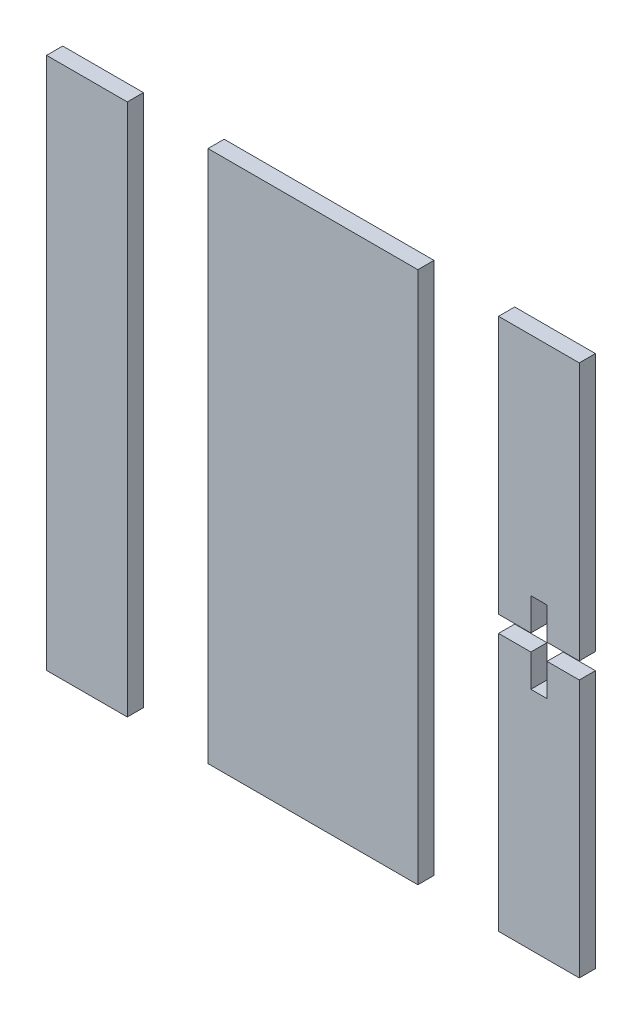
ISO-10303-21;
HEADER;
FILE_DESCRIPTION(('STEP AP214'),'2;1');
FILE_NAME('part.step','',(''),(''),'','','');
FILE_SCHEMA(('AUTOMOTIVE_DESIGN { 1 0 10303 214 1 1 1 1 }'));
ENDSEC;
DATA;
#1=APPLICATION_CONTEXT('core data for automotive mechanical design processes');
#2=APPLICATION_PROTOCOL_DEFINITION('international standard','automotive_design',2000,#1);
#3=PRODUCT_CONTEXT('',#1,'mechanical');
#4=PRODUCT('Part','Part','',(#3));
#5=PRODUCT_RELATED_PRODUCT_CATEGORY('part','',(#4));
#6=PRODUCT_DEFINITION_FORMATION('','',#4);
#7=PRODUCT_DEFINITION_CONTEXT('part definition',#1,'design');
#8=PRODUCT_DEFINITION('design','',#6,#7);
#9=PRODUCT_DEFINITION_SHAPE('','',#8);
#10=(LENGTH_UNIT() NAMED_UNIT(*) SI_UNIT(.MILLI.,.METRE.));
#11=(NAMED_UNIT(*) PLANE_ANGLE_UNIT() SI_UNIT($,.RADIAN.));
#12=(NAMED_UNIT(*) SI_UNIT($,.STERADIAN.) SOLID_ANGLE_UNIT());
#13=UNCERTAINTY_MEASURE_WITH_UNIT(LENGTH_MEASURE(1.E-05),#10,'distance_accuracy_value','');
#14=(GEOMETRIC_REPRESENTATION_CONTEXT(3) GLOBAL_UNCERTAINTY_ASSIGNED_CONTEXT((#13)) GLOBAL_UNIT_ASSIGNED_CONTEXT((#10,
#11,#12)) REPRESENTATION_CONTEXT('',''));
#15=CARTESIAN_POINT('',(0.,0.,0.));
#16=DIRECTION('',(0.,0.,1.));
#17=DIRECTION('',(1.,0.,0.));
#18=AXIS2_PLACEMENT_3D('',#15,#16,#17);
#19=CARTESIAN_POINT('',(3.53495725651415,0.,0.1));
#20=DIRECTION('',(1.,0.,0.));
#21=DIRECTION('',(0.,0.,-1.));
#22=AXIS2_PLACEMENT_3D('',#19,#20,#21);
#23=PLANE('',#22);
#24=DIRECTION('',(0.,0.,1.));
#25=VECTOR('',#24,1.);
#26=CARTESIAN_POINT('',(3.53495725651415,1.58020971020154,0.));
#27=LINE('',#26,#25);
#28=CARTESIAN_POINT('',(3.53495725651415,1.58020971020154,0.));
#29=VERTEX_POINT('',#28);
#30=CARTESIAN_POINT('',(3.53495725651415,1.58020971020154,0.1));
#31=VERTEX_POINT('',#30);
#32=EDGE_CURVE('E12',#29,#31,#27,.T.);
#33=ORIENTED_EDGE('',*,*,#32,.F.);
#34=DIRECTION('',(0.,-1.,0.));
#35=VECTOR('',#34,1.);
#36=CARTESIAN_POINT('',(3.53495725651415,0.,0.));
#37=LINE('',#36,#35);
#38=CARTESIAN_POINT('',(3.53495725651415,3.1790821036664,0.));
#39=VERTEX_POINT('',#38);
#40=EDGE_CURVE('E49',#39,#29,#37,.T.);
#41=ORIENTED_EDGE('',*,*,#40,.F.);
#42=DIRECTION('',(0.,0.,-1.));
#43=VECTOR('',#42,1.);
#44=CARTESIAN_POINT('',(3.53495725651415,3.1790821036664,0.1));
#45=LINE('',#44,#43);
#46=CARTESIAN_POINT('',(3.53495725651415,3.1790821036664,0.1));
#47=VERTEX_POINT('',#46);
#48=EDGE_CURVE('E136',#47,#39,#45,.T.);
#49=ORIENTED_EDGE('',*,*,#48,.F.);
#50=DIRECTION('',(0.,-1.,0.));
#51=VECTOR('',#50,1.);
#52=CARTESIAN_POINT('',(3.53495725651415,0.,0.1));
#53=LINE('',#52,#51);
#54=EDGE_CURVE('E134',#47,#31,#53,.T.);
#55=ORIENTED_EDGE('',*,*,#54,.T.);
#56=EDGE_LOOP('',(#33,#41,#49,#55));
#57=FACE_BOUND('',#56,.T.);
#58=ADVANCED_FACE('F46',(#57),#23,.T.);
#59=CARTESIAN_POINT('',(3.03495725651415,0.,0.1));
#60=DIRECTION('',(1.,0.,0.));
#61=DIRECTION('',(0.,1.,0.));
#62=AXIS2_PLACEMENT_3D('',#59,#60,#61);
#63=PLANE('',#62);
#64=DIRECTION('',(0.,-1.,0.));
#65=VECTOR('',#64,1.);
#66=CARTESIAN_POINT('',(3.03495725651415,0.,0.));
#67=LINE('',#66,#65);
#68=CARTESIAN_POINT('',(3.03495725651415,3.1790821036664,0.));
#69=VERTEX_POINT('',#68);
#70=CARTESIAN_POINT('',(3.03495725651415,1.58020971020154,0.));
#71=VERTEX_POINT('',#70);
#72=EDGE_CURVE('E116',#69,#71,#67,.T.);
#73=ORIENTED_EDGE('',*,*,#72,.T.);
#74=DIRECTION('',(0.,0.,1.));
#75=VECTOR('',#74,1.);
#76=CARTESIAN_POINT('',(3.03495725651415,1.58020971020154,0.));
#77=LINE('',#76,#75);
#78=CARTESIAN_POINT('',(3.03495725651415,1.58020971020154,0.1));
#79=VERTEX_POINT('',#78);
#80=EDGE_CURVE('E123',#71,#79,#77,.T.);
#81=ORIENTED_EDGE('',*,*,#80,.T.);
#82=DIRECTION('',(0.,-1.,0.));
#83=VECTOR('',#82,1.);
#84=CARTESIAN_POINT('',(3.03495725651415,0.,0.1));
#85=LINE('',#84,#83);
#86=CARTESIAN_POINT('',(3.03495725651415,3.1790821036664,0.1));
#87=VERTEX_POINT('',#86);
#88=EDGE_CURVE('E118',#87,#79,#85,.T.);
#89=ORIENTED_EDGE('',*,*,#88,.F.);
#90=DIRECTION('',(0.,0.,-1.));
#91=VECTOR('',#90,1.);
#92=CARTESIAN_POINT('',(3.03495725651415,3.1790821036664,0.1));
#93=LINE('',#92,#91);
#94=EDGE_CURVE('E112',#87,#69,#93,.T.);
#95=ORIENTED_EDGE('',*,*,#94,.T.);
#96=EDGE_LOOP('',(#73,#81,#89,#95));
#97=FACE_BOUND('',#96,.T.);
#98=ADVANCED_FACE('F114',(#97),#63,.F.);
#99=CARTESIAN_POINT('',(0.,0.,0.1));
#100=DIRECTION('',(0.,0.,1.));
#101=DIRECTION('',(1.,0.,0.));
#102=AXIS2_PLACEMENT_3D('',#99,#100,#101);
#103=PLANE('',#102);
#104=DIRECTION('',(-1.,0.,0.));
#105=VECTOR('',#104,1.);
#106=CARTESIAN_POINT('',(3.03495725651415,1.58020971020154,0.1));
#107=LINE('',#106,#105);
#108=CARTESIAN_POINT('',(3.23495725651415,1.58020971020154,0.1));
#109=VERTEX_POINT('',#108);
#110=EDGE_CURVE('E158',#109,#79,#107,.T.);
#111=ORIENTED_EDGE('',*,*,#110,.F.);
#112=DIRECTION('',(0.,-1.,0.));
#113=VECTOR('',#112,1.);
#114=CARTESIAN_POINT('',(3.23495725651415,1.78020971020154,0.1));
#115=LINE('',#114,#113);
#116=CARTESIAN_POINT('',(3.23495725651415,1.78020971020154,0.1));
#117=VERTEX_POINT('',#116);
#118=EDGE_CURVE('E155',#117,#109,#115,.T.);
#119=ORIENTED_EDGE('',*,*,#118,.F.);
#120=DIRECTION('',(-1.,0.,0.));
#121=VECTOR('',#120,1.);
#122=CARTESIAN_POINT('',(3.23495725651415,1.78020971020154,0.1));
#123=LINE('',#122,#121);
#124=CARTESIAN_POINT('',(3.33495725651415,1.78020971020154,0.1));
#125=VERTEX_POINT('',#124);
#126=EDGE_CURVE('E152',#125,#117,#123,.T.);
#127=ORIENTED_EDGE('',*,*,#126,.F.);
#128=DIRECTION('',(0.,1.,0.));
#129=VECTOR('',#128,1.);
#130=CARTESIAN_POINT('',(3.33495725651415,1.78020971020154,0.1));
#131=LINE('',#130,#129);
#132=CARTESIAN_POINT('',(3.33495725651415,1.58020971020154,0.1));
#133=VERTEX_POINT('',#132);
#134=EDGE_CURVE('E150',#133,#125,#131,.T.);
#135=ORIENTED_EDGE('',*,*,#134,.F.);
#136=DIRECTION('',(-1.,0.,0.));
#137=VECTOR('',#136,1.);
#138=CARTESIAN_POINT('',(3.33495725651415,1.58020971020154,0.1));
#139=LINE('',#138,#137);
#140=EDGE_CURVE('E55',#31,#133,#139,.T.);
#141=ORIENTED_EDGE('',*,*,#140,.F.);
#142=ORIENTED_EDGE('',*,*,#54,.F.);
#143=DIRECTION('',(1.,0.,0.));
#144=VECTOR('',#143,1.);
#145=CARTESIAN_POINT('',(0.,3.1790821036664,0.1));
#146=LINE('',#145,#144);
#147=EDGE_CURVE('E144',#87,#47,#146,.T.);
#148=ORIENTED_EDGE('',*,*,#147,.F.);
#149=ORIENTED_EDGE('',*,*,#88,.T.);
#150=EDGE_LOOP('',(#111,#119,#127,#135,#141,#142,#148,#149));
#151=FACE_BOUND('',#150,.T.);
#152=ADVANCED_FACE('F180',(#151),#103,.T.);
#153=CARTESIAN_POINT('',(0.,0.,0.));
#154=DIRECTION('',(0.,0.,1.));
#155=DIRECTION('',(1.,0.,0.));
#156=AXIS2_PLACEMENT_3D('',#153,#154,#155);
#157=PLANE('',#156);
#158=DIRECTION('',(0.,-1.,0.));
#159=VECTOR('',#158,1.);
#160=CARTESIAN_POINT('',(3.23495725651415,1.78020971020154,0.));
#161=LINE('',#160,#159);
#162=CARTESIAN_POINT('',(3.23495725651415,1.78020971020154,0.));
#163=VERTEX_POINT('',#162);
#164=CARTESIAN_POINT('',(3.23495725651415,1.58020971020154,0.));
#165=VERTEX_POINT('',#164);
#166=EDGE_CURVE('E140',#163,#165,#161,.T.);
#167=ORIENTED_EDGE('',*,*,#166,.T.);
#168=DIRECTION('',(-1.,0.,0.));
#169=VECTOR('',#168,1.);
#170=CARTESIAN_POINT('',(3.03495725651415,1.58020971020154,0.));
#171=LINE('',#170,#169);
#172=EDGE_CURVE('E133',#165,#71,#171,.T.);
#173=ORIENTED_EDGE('',*,*,#172,.T.);
#174=ORIENTED_EDGE('',*,*,#72,.F.);
#175=DIRECTION('',(1.,0.,0.));
#176=VECTOR('',#175,1.);
#177=CARTESIAN_POINT('',(0.,3.1790821036664,0.));
#178=LINE('',#177,#176);
#179=EDGE_CURVE('E131',#69,#39,#178,.T.);
#180=ORIENTED_EDGE('',*,*,#179,.T.);
#181=ORIENTED_EDGE('',*,*,#40,.T.);
#182=DIRECTION('',(-1.,0.,0.));
#183=VECTOR('',#182,1.);
#184=CARTESIAN_POINT('',(3.33495725651415,1.58020971020154,0.));
#185=LINE('',#184,#183);
#186=CARTESIAN_POINT('',(3.33495725651415,1.58020971020154,0.));
#187=VERTEX_POINT('',#186);
#188=EDGE_CURVE('E139',#29,#187,#185,.T.);
#189=ORIENTED_EDGE('',*,*,#188,.T.);
#190=DIRECTION('',(0.,1.,0.));
#191=VECTOR('',#190,1.);
#192=CARTESIAN_POINT('',(3.33495725651415,1.78020971020154,0.));
#193=LINE('',#192,#191);
#194=CARTESIAN_POINT('',(3.33495725651415,1.78020971020154,0.));
#195=VERTEX_POINT('',#194);
#196=EDGE_CURVE('E169',#187,#195,#193,.T.);
#197=ORIENTED_EDGE('',*,*,#196,.T.);
#198=DIRECTION('',(-1.,0.,0.));
#199=VECTOR('',#198,1.);
#200=CARTESIAN_POINT('',(3.23495725651415,1.78020971020154,0.));
#201=LINE('',#200,#199);
#202=EDGE_CURVE('E145',#195,#163,#201,.T.);
#203=ORIENTED_EDGE('',*,*,#202,.T.);
#204=EDGE_LOOP('',(#167,#173,#174,#180,#181,#189,#197,#203));
#205=FACE_BOUND('',#204,.T.);
#206=ADVANCED_FACE('F129',(#205),#157,.F.);
#207=CARTESIAN_POINT('',(0.,3.1790821036664,0.1));
#208=DIRECTION('',(0.,1.,0.));
#209=DIRECTION('',(0.,0.,1.));
#210=AXIS2_PLACEMENT_3D('',#207,#208,#209);
#211=PLANE('',#210);
#212=ORIENTED_EDGE('',*,*,#179,.F.);
#213=ORIENTED_EDGE('',*,*,#94,.F.);
#214=ORIENTED_EDGE('',*,*,#147,.T.);
#215=ORIENTED_EDGE('',*,*,#48,.T.);
#216=EDGE_LOOP('',(#212,#213,#214,#215));
#217=FACE_BOUND('',#216,.T.);
#218=ADVANCED_FACE('F135',(#217),#211,.T.);
#219=CARTESIAN_POINT('',(3.03495725651415,1.58020971020154,0.));
#220=DIRECTION('',(0.,1.,0.));
#221=DIRECTION('',(0.,0.,1.));
#222=AXIS2_PLACEMENT_3D('',#219,#220,#221);
#223=PLANE('',#222);
#224=ORIENTED_EDGE('',*,*,#110,.T.);
#225=ORIENTED_EDGE('',*,*,#80,.F.);
#226=ORIENTED_EDGE('',*,*,#172,.F.);
#227=DIRECTION('',(0.,0.,1.));
#228=VECTOR('',#227,1.);
#229=CARTESIAN_POINT('',(3.23495725651415,1.58020971020154,0.));
#230=LINE('',#229,#228);
#231=EDGE_CURVE('E156',#165,#109,#230,.T.);
#232=ORIENTED_EDGE('',*,*,#231,.T.);
#233=EDGE_LOOP('',(#224,#225,#226,#232));
#234=FACE_BOUND('',#233,.T.);
#235=ADVANCED_FACE('F192',(#234),#223,.F.);
#236=CARTESIAN_POINT('',(3.23495725651415,1.78020971020154,0.));
#237=DIRECTION('',(-1.,0.,0.));
#238=DIRECTION('',(0.,0.,1.));
#239=AXIS2_PLACEMENT_3D('',#236,#237,#238);
#240=PLANE('',#239);
#241=ORIENTED_EDGE('',*,*,#118,.T.);
#242=ORIENTED_EDGE('',*,*,#231,.F.);
#243=ORIENTED_EDGE('',*,*,#166,.F.);
#244=DIRECTION('',(0.,0.,1.));
#245=VECTOR('',#244,1.);
#246=CARTESIAN_POINT('',(3.23495725651415,1.78020971020154,0.));
#247=LINE('',#246,#245);
#248=EDGE_CURVE('E153',#163,#117,#247,.T.);
#249=ORIENTED_EDGE('',*,*,#248,.T.);
#250=EDGE_LOOP('',(#241,#242,#243,#249));
#251=FACE_BOUND('',#250,.T.);
#252=ADVANCED_FACE('F190',(#251),#240,.F.);
#253=CARTESIAN_POINT('',(3.23495725651415,1.78020971020154,0.));
#254=DIRECTION('',(0.,1.,0.));
#255=DIRECTION('',(0.,0.,1.));
#256=AXIS2_PLACEMENT_3D('',#253,#254,#255);
#257=PLANE('',#256);
#258=ORIENTED_EDGE('',*,*,#126,.T.);
#259=ORIENTED_EDGE('',*,*,#248,.F.);
#260=ORIENTED_EDGE('',*,*,#202,.F.);
#261=DIRECTION('',(0.,0.,1.));
#262=VECTOR('',#261,1.);
#263=CARTESIAN_POINT('',(3.33495725651415,1.78020971020154,0.));
#264=LINE('',#263,#262);
#265=EDGE_CURVE('E86',#195,#125,#264,.T.);
#266=ORIENTED_EDGE('',*,*,#265,.T.);
#267=EDGE_LOOP('',(#258,#259,#260,#266));
#268=FACE_BOUND('',#267,.T.);
#269=ADVANCED_FACE('F187',(#268),#257,.F.);
#270=CARTESIAN_POINT('',(3.33495725651415,1.78020971020154,0.));
#271=DIRECTION('',(1.,0.,0.));
#272=DIRECTION('',(0.,1.,0.));
#273=AXIS2_PLACEMENT_3D('',#270,#271,#272);
#274=PLANE('',#273);
#275=ORIENTED_EDGE('',*,*,#134,.T.);
#276=ORIENTED_EDGE('',*,*,#265,.F.);
#277=ORIENTED_EDGE('',*,*,#196,.F.);
#278=DIRECTION('',(0.,0.,1.));
#279=VECTOR('',#278,1.);
#280=CARTESIAN_POINT('',(3.33495725651415,1.58020971020154,0.));
#281=LINE('',#280,#279);
#282=EDGE_CURVE('E147',#187,#133,#281,.T.);
#283=ORIENTED_EDGE('',*,*,#282,.T.);
#284=EDGE_LOOP('',(#275,#276,#277,#283));
#285=FACE_BOUND('',#284,.T.);
#286=ADVANCED_FACE('F185',(#285),#274,.F.);
#287=CARTESIAN_POINT('',(3.33495725651415,1.58020971020154,0.));
#288=DIRECTION('',(0.,1.,0.));
#289=DIRECTION('',(0.,0.,1.));
#290=AXIS2_PLACEMENT_3D('',#287,#288,#289);
#291=PLANE('',#290);
#292=ORIENTED_EDGE('',*,*,#140,.T.);
#293=ORIENTED_EDGE('',*,*,#282,.F.);
#294=ORIENTED_EDGE('',*,*,#188,.F.);
#295=ORIENTED_EDGE('',*,*,#32,.T.);
#296=EDGE_LOOP('',(#292,#293,#294,#295));
#297=FACE_BOUND('',#296,.T.);
#298=ADVANCED_FACE('F184',(#297),#291,.F.);
#299=CLOSED_SHELL('',(#58,#98,#152,#206,#218,#235,#252,#269,#286,#298));
#300=MANIFOLD_SOLID_BREP('B2',#299);
#301=CARTESIAN_POINT('',(0.,-0.120917896333602,0.1));
#302=DIRECTION('',(0.,1.,0.));
#303=DIRECTION('',(0.,0.,1.));
#304=AXIS2_PLACEMENT_3D('',#301,#302,#303);
#305=PLANE('',#304);
#306=DIRECTION('',(1.,0.,0.));
#307=VECTOR('',#306,1.);
#308=CARTESIAN_POINT('',(0.,-0.120917896333602,0.));
#309=LINE('',#308,#307);
#310=CARTESIAN_POINT('',(3.03495725651415,-0.120917896333602,0.));
#311=VERTEX_POINT('',#310);
#312=CARTESIAN_POINT('',(3.53495725651415,-0.120917896333602,0.));
#313=VERTEX_POINT('',#312);
#314=EDGE_CURVE('E328',#311,#313,#309,.T.);
#315=ORIENTED_EDGE('',*,*,#314,.T.);
#316=DIRECTION('',(0.,0.,-1.));
#317=VECTOR('',#316,1.);
#318=CARTESIAN_POINT('',(3.53495725651415,-0.120917896333602,0.1));
#319=LINE('',#318,#317);
#320=CARTESIAN_POINT('',(3.53495725651415,-0.120917896333602,0.1));
#321=VERTEX_POINT('',#320);
#322=EDGE_CURVE('E292',#321,#313,#319,.T.);
#323=ORIENTED_EDGE('',*,*,#322,.F.);
#324=DIRECTION('',(1.,0.,0.));
#325=VECTOR('',#324,1.);
#326=CARTESIAN_POINT('',(0.,-0.120917896333602,0.1));
#327=LINE('',#326,#325);
#328=CARTESIAN_POINT('',(3.03495725651415,-0.120917896333602,0.1));
#329=VERTEX_POINT('',#328);
#330=EDGE_CURVE('E337',#329,#321,#327,.T.);
#331=ORIENTED_EDGE('',*,*,#330,.F.);
#332=DIRECTION('',(0.,0.,-1.));
#333=VECTOR('',#332,1.);
#334=CARTESIAN_POINT('',(3.03495725651415,-0.120917896333602,0.1));
#335=LINE('',#334,#333);
#336=EDGE_CURVE('E44',#329,#311,#335,.T.);
#337=ORIENTED_EDGE('',*,*,#336,.T.);
#338=EDGE_LOOP('',(#315,#323,#331,#337));
#339=FACE_BOUND('',#338,.T.);
#340=ADVANCED_FACE('F284',(#339),#305,.F.);
#341=CARTESIAN_POINT('',(0.,0.,0.));
#342=DIRECTION('',(0.,0.,1.));
#343=DIRECTION('',(1.,0.,0.));
#344=AXIS2_PLACEMENT_3D('',#341,#342,#343);
#345=PLANE('',#344);
#346=DIRECTION('',(0.,1.,0.));
#347=VECTOR('',#346,1.);
#348=CARTESIAN_POINT('',(3.33495725651415,1.47795449713126,0.));
#349=LINE('',#348,#347);
#350=CARTESIAN_POINT('',(3.33495725651415,1.27795449713126,0.));
#351=VERTEX_POINT('',#350);
#352=CARTESIAN_POINT('',(3.33495725651415,1.47795449713126,0.));
#353=VERTEX_POINT('',#352);
#354=EDGE_CURVE('E378',#351,#353,#349,.T.);
#355=ORIENTED_EDGE('',*,*,#354,.T.);
#356=DIRECTION('',(1.,0.,0.));
#357=VECTOR('',#356,1.);
#358=CARTESIAN_POINT('',(3.33495725651415,1.47795449713126,0.));
#359=LINE('',#358,#357);
#360=CARTESIAN_POINT('',(3.53495725651415,1.47795449713126,0.));
#361=VERTEX_POINT('',#360);
#362=EDGE_CURVE('E330',#353,#361,#359,.T.);
#363=ORIENTED_EDGE('',*,*,#362,.T.);
#364=DIRECTION('',(0.,-1.,0.));
#365=VECTOR('',#364,1.);
#366=CARTESIAN_POINT('',(3.53495725651415,0.,0.));
#367=LINE('',#366,#365);
#368=EDGE_CURVE('E323',#361,#313,#367,.T.);
#369=ORIENTED_EDGE('',*,*,#368,.T.);
#370=ORIENTED_EDGE('',*,*,#314,.F.);
#371=DIRECTION('',(0.,-1.,0.));
#372=VECTOR('',#371,1.);
#373=CARTESIAN_POINT('',(3.03495725651415,0.,0.));
#374=LINE('',#373,#372);
#375=CARTESIAN_POINT('',(3.03495725651415,1.47795449713126,0.));
#376=VERTEX_POINT('',#375);
#377=EDGE_CURVE('E331',#376,#311,#374,.T.);
#378=ORIENTED_EDGE('',*,*,#377,.F.);
#379=DIRECTION('',(1.,0.,0.));
#380=VECTOR('',#379,1.);
#381=CARTESIAN_POINT('',(3.03495725651415,1.47795449713126,0.));
#382=LINE('',#381,#380);
#383=CARTESIAN_POINT('',(3.23495725651415,1.47795449713126,0.));
#384=VERTEX_POINT('',#383);
#385=EDGE_CURVE('E364',#376,#384,#382,.T.);
#386=ORIENTED_EDGE('',*,*,#385,.T.);
#387=DIRECTION('',(0.,-1.,0.));
#388=VECTOR('',#387,1.);
#389=CARTESIAN_POINT('',(3.23495725651415,1.47795449713126,0.));
#390=LINE('',#389,#388);
#391=CARTESIAN_POINT('',(3.23495725651415,1.27795449713126,0.));
#392=VERTEX_POINT('',#391);
#393=EDGE_CURVE('E299',#384,#392,#390,.T.);
#394=ORIENTED_EDGE('',*,*,#393,.T.);
#395=DIRECTION('',(1.,0.,0.));
#396=VECTOR('',#395,1.);
#397=CARTESIAN_POINT('',(3.23495725651415,1.27795449713126,0.));
#398=LINE('',#397,#396);
#399=EDGE_CURVE('E380',#392,#351,#398,.T.);
#400=ORIENTED_EDGE('',*,*,#399,.T.);
#401=EDGE_LOOP('',(#355,#363,#369,#370,#378,#386,#394,#400));
#402=FACE_BOUND('',#401,.T.);
#403=ADVANCED_FACE('F325',(#402),#345,.F.);
#404=CARTESIAN_POINT('',(0.,0.,0.1));
#405=DIRECTION('',(0.,0.,1.));
#406=DIRECTION('',(1.,0.,0.));
#407=AXIS2_PLACEMENT_3D('',#404,#405,#406);
#408=PLANE('',#407);
#409=DIRECTION('',(1.,0.,0.));
#410=VECTOR('',#409,1.);
#411=CARTESIAN_POINT('',(3.33495725651415,1.47795449713126,0.1));
#412=LINE('',#411,#410);
#413=CARTESIAN_POINT('',(3.33495725651415,1.47795449713126,0.1));
#414=VERTEX_POINT('',#413);
#415=CARTESIAN_POINT('',(3.53495725651415,1.47795449713126,0.1));
#416=VERTEX_POINT('',#415);
#417=EDGE_CURVE('E361',#414,#416,#412,.T.);
#418=ORIENTED_EDGE('',*,*,#417,.F.);
#419=DIRECTION('',(0.,1.,0.));
#420=VECTOR('',#419,1.);
#421=CARTESIAN_POINT('',(3.33495725651415,1.47795449713126,0.1));
#422=LINE('',#421,#420);
#423=CARTESIAN_POINT('',(3.33495725651415,1.27795449713126,0.1));
#424=VERTEX_POINT('',#423);
#425=EDGE_CURVE('E365',#424,#414,#422,.T.);
#426=ORIENTED_EDGE('',*,*,#425,.F.);
#427=DIRECTION('',(1.,0.,0.));
#428=VECTOR('',#427,1.);
#429=CARTESIAN_POINT('',(3.23495725651415,1.27795449713126,0.1));
#430=LINE('',#429,#428);
#431=CARTESIAN_POINT('',(3.23495725651415,1.27795449713126,0.1));
#432=VERTEX_POINT('',#431);
#433=EDGE_CURVE('E368',#432,#424,#430,.T.);
#434=ORIENTED_EDGE('',*,*,#433,.F.);
#435=DIRECTION('',(0.,-1.,0.));
#436=VECTOR('',#435,1.);
#437=CARTESIAN_POINT('',(3.23495725651415,1.47795449713126,0.1));
#438=LINE('',#437,#436);
#439=CARTESIAN_POINT('',(3.23495725651415,1.47795449713126,0.1));
#440=VERTEX_POINT('',#439);
#441=EDGE_CURVE('E371',#440,#432,#438,.T.);
#442=ORIENTED_EDGE('',*,*,#441,.F.);
#443=DIRECTION('',(1.,0.,0.));
#444=VECTOR('',#443,1.);
#445=CARTESIAN_POINT('',(3.03495725651415,1.47795449713126,0.1));
#446=LINE('',#445,#444);
#447=CARTESIAN_POINT('',(3.03495725651415,1.47795449713126,0.1));
#448=VERTEX_POINT('',#447);
#449=EDGE_CURVE('E374',#448,#440,#446,.T.);
#450=ORIENTED_EDGE('',*,*,#449,.F.);
#451=DIRECTION('',(0.,-1.,0.));
#452=VECTOR('',#451,1.);
#453=CARTESIAN_POINT('',(3.03495725651415,0.,0.1));
#454=LINE('',#453,#452);
#455=EDGE_CURVE('E340',#448,#329,#454,.T.);
#456=ORIENTED_EDGE('',*,*,#455,.T.);
#457=ORIENTED_EDGE('',*,*,#330,.T.);
#458=DIRECTION('',(0.,-1.,0.));
#459=VECTOR('',#458,1.);
#460=CARTESIAN_POINT('',(3.53495725651415,0.,0.1));
#461=LINE('',#460,#459);
#462=EDGE_CURVE('E308',#416,#321,#461,.T.);
#463=ORIENTED_EDGE('',*,*,#462,.F.);
#464=EDGE_LOOP('',(#418,#426,#434,#442,#450,#456,#457,#463));
#465=FACE_BOUND('',#464,.T.);
#466=ADVANCED_FACE('F402',(#465),#408,.T.);
#467=CARTESIAN_POINT('',(3.03495725651415,0.,0.1));
#468=DIRECTION('',(1.,0.,0.));
#469=DIRECTION('',(0.,1.,0.));
#470=AXIS2_PLACEMENT_3D('',#467,#468,#469);
#471=PLANE('',#470);
#472=ORIENTED_EDGE('',*,*,#455,.F.);
#473=DIRECTION('',(0.,0.,1.));
#474=VECTOR('',#473,1.);
#475=CARTESIAN_POINT('',(3.03495725651415,1.47795449713126,0.));
#476=LINE('',#475,#474);
#477=EDGE_CURVE('E346',#376,#448,#476,.T.);
#478=ORIENTED_EDGE('',*,*,#477,.F.);
#479=ORIENTED_EDGE('',*,*,#377,.T.);
#480=ORIENTED_EDGE('',*,*,#336,.F.);
#481=EDGE_LOOP('',(#472,#478,#479,#480));
#482=FACE_BOUND('',#481,.T.);
#483=ADVANCED_FACE('F397',(#482),#471,.F.);
#484=CARTESIAN_POINT('',(3.53495725651415,0.,0.1));
#485=DIRECTION('',(1.,0.,0.));
#486=DIRECTION('',(0.,0.,-1.));
#487=AXIS2_PLACEMENT_3D('',#484,#485,#486);
#488=PLANE('',#487);
#489=DIRECTION('',(0.,0.,1.));
#490=VECTOR('',#489,1.);
#491=CARTESIAN_POINT('',(3.53495725651415,1.47795449713126,0.));
#492=LINE('',#491,#490);
#493=EDGE_CURVE('E332',#361,#416,#492,.T.);
#494=ORIENTED_EDGE('',*,*,#493,.T.);
#495=ORIENTED_EDGE('',*,*,#462,.T.);
#496=ORIENTED_EDGE('',*,*,#322,.T.);
#497=ORIENTED_EDGE('',*,*,#368,.F.);
#498=EDGE_LOOP('',(#494,#495,#496,#497));
#499=FACE_BOUND('',#498,.T.);
#500=ADVANCED_FACE('F286',(#499),#488,.T.);
#501=CARTESIAN_POINT('',(3.03495725651415,1.47795449713126,0.));
#502=DIRECTION('',(0.,-1.,0.));
#503=DIRECTION('',(0.,0.,-1.));
#504=AXIS2_PLACEMENT_3D('',#501,#502,#503);
#505=PLANE('',#504);
#506=ORIENTED_EDGE('',*,*,#449,.T.);
#507=DIRECTION('',(0.,0.,1.));
#508=VECTOR('',#507,1.);
#509=CARTESIAN_POINT('',(3.23495725651415,1.47795449713126,0.));
#510=LINE('',#509,#508);
#511=EDGE_CURVE('E349',#384,#440,#510,.T.);
#512=ORIENTED_EDGE('',*,*,#511,.F.);
#513=ORIENTED_EDGE('',*,*,#385,.F.);
#514=ORIENTED_EDGE('',*,*,#477,.T.);
#515=EDGE_LOOP('',(#506,#512,#513,#514));
#516=FACE_BOUND('',#515,.T.);
#517=ADVANCED_FACE('F390',(#516),#505,.F.);
#518=CARTESIAN_POINT('',(3.23495725651415,1.47795449713126,0.));
#519=DIRECTION('',(-1.,0.,0.));
#520=DIRECTION('',(0.,0.,1.));
#521=AXIS2_PLACEMENT_3D('',#518,#519,#520);
#522=PLANE('',#521);
#523=ORIENTED_EDGE('',*,*,#441,.T.);
#524=DIRECTION('',(0.,0.,1.));
#525=VECTOR('',#524,1.);
#526=CARTESIAN_POINT('',(3.23495725651415,1.27795449713126,0.));
#527=LINE('',#526,#525);
#528=EDGE_CURVE('E351',#392,#432,#527,.T.);
#529=ORIENTED_EDGE('',*,*,#528,.F.);
#530=ORIENTED_EDGE('',*,*,#393,.F.);
#531=ORIENTED_EDGE('',*,*,#511,.T.);
#532=EDGE_LOOP('',(#523,#529,#530,#531));
#533=FACE_BOUND('',#532,.T.);
#534=ADVANCED_FACE('F427',(#533),#522,.F.);
#535=CARTESIAN_POINT('',(3.23495725651415,1.27795449713126,0.));
#536=DIRECTION('',(0.,-1.,0.));
#537=DIRECTION('',(0.,0.,-1.));
#538=AXIS2_PLACEMENT_3D('',#535,#536,#537);
#539=PLANE('',#538);
#540=ORIENTED_EDGE('',*,*,#433,.T.);
#541=DIRECTION('',(0.,0.,1.));
#542=VECTOR('',#541,1.);
#543=CARTESIAN_POINT('',(3.33495725651415,1.27795449713126,0.));
#544=LINE('',#543,#542);
#545=EDGE_CURVE('E354',#351,#424,#544,.T.);
#546=ORIENTED_EDGE('',*,*,#545,.F.);
#547=ORIENTED_EDGE('',*,*,#399,.F.);
#548=ORIENTED_EDGE('',*,*,#528,.T.);
#549=EDGE_LOOP('',(#540,#546,#547,#548));
#550=FACE_BOUND('',#549,.T.);
#551=ADVANCED_FACE('F426',(#550),#539,.F.);
#552=CARTESIAN_POINT('',(3.33495725651415,1.47795449713126,0.));
#553=DIRECTION('',(1.,0.,0.));
#554=DIRECTION('',(0.,0.,-1.));
#555=AXIS2_PLACEMENT_3D('',#552,#553,#554);
#556=PLANE('',#555);
#557=ORIENTED_EDGE('',*,*,#425,.T.);
#558=DIRECTION('',(0.,0.,1.));
#559=VECTOR('',#558,1.);
#560=CARTESIAN_POINT('',(3.33495725651415,1.47795449713126,0.));
#561=LINE('',#560,#559);
#562=EDGE_CURVE('E357',#353,#414,#561,.T.);
#563=ORIENTED_EDGE('',*,*,#562,.F.);
#564=ORIENTED_EDGE('',*,*,#354,.F.);
#565=ORIENTED_EDGE('',*,*,#545,.T.);
#566=EDGE_LOOP('',(#557,#563,#564,#565));
#567=FACE_BOUND('',#566,.T.);
#568=ADVANCED_FACE('F419',(#567),#556,.F.);
#569=CARTESIAN_POINT('',(3.33495725651415,1.47795449713126,0.));
#570=DIRECTION('',(0.,-1.,0.));
#571=DIRECTION('',(0.,0.,-1.));
#572=AXIS2_PLACEMENT_3D('',#569,#570,#571);
#573=PLANE('',#572);
#574=ORIENTED_EDGE('',*,*,#417,.T.);
#575=ORIENTED_EDGE('',*,*,#493,.F.);
#576=ORIENTED_EDGE('',*,*,#362,.F.);
#577=ORIENTED_EDGE('',*,*,#562,.T.);
#578=EDGE_LOOP('',(#574,#575,#576,#577));
#579=FACE_BOUND('',#578,.T.);
#580=ADVANCED_FACE('F415',(#579),#573,.F.);
#581=CLOSED_SHELL('',(#340,#403,#466,#483,#500,#517,#534,#551,#568,#580));
#582=MANIFOLD_SOLID_BREP('B6',#581);
#583=CARTESIAN_POINT('',(2.53495725651415,0.,0.1));
#584=DIRECTION('',(1.,0.,0.));
#585=DIRECTION('',(0.,1.,0.));
#586=AXIS2_PLACEMENT_3D('',#583,#584,#585);
#587=PLANE('',#586);
#588=DIRECTION('',(0.,-1.,0.));
#589=VECTOR('',#588,1.);
#590=CARTESIAN_POINT('',(2.53495725651415,0.,0.));
#591=LINE('',#590,#589);
#592=CARTESIAN_POINT('',(2.53495725651415,3.1790821036664,0.));
#593=VERTEX_POINT('',#592);
#594=CARTESIAN_POINT('',(2.53495725651415,-0.120917896333602,0.));
#595=VERTEX_POINT('',#594);
#596=EDGE_CURVE('E584',#593,#595,#591,.T.);
#597=ORIENTED_EDGE('',*,*,#596,.F.);
#598=DIRECTION('',(0.,0.,-1.));
#599=VECTOR('',#598,1.);
#600=CARTESIAN_POINT('',(2.53495725651415,3.1790821036664,0.1));
#601=LINE('',#600,#599);
#602=CARTESIAN_POINT('',(2.53495725651415,3.1790821036664,0.1));
#603=VERTEX_POINT('',#602);
#604=EDGE_CURVE('E282',#603,#593,#601,.T.);
#605=ORIENTED_EDGE('',*,*,#604,.F.);
#606=DIRECTION('',(0.,-1.,0.));
#607=VECTOR('',#606,1.);
#608=CARTESIAN_POINT('',(2.53495725651415,0.,0.1));
#609=LINE('',#608,#607);
#610=CARTESIAN_POINT('',(2.53495725651415,-0.120917896333602,0.1));
#611=VERTEX_POINT('',#610);
#612=EDGE_CURVE('E578',#603,#611,#609,.T.);
#613=ORIENTED_EDGE('',*,*,#612,.T.);
#614=DIRECTION('',(0.,0.,-1.));
#615=VECTOR('',#614,1.);
#616=CARTESIAN_POINT('',(2.53495725651415,-0.120917896333602,0.1));
#617=LINE('',#616,#615);
#618=EDGE_CURVE('E559',#611,#595,#617,.T.);
#619=ORIENTED_EDGE('',*,*,#618,.T.);
#620=EDGE_LOOP('',(#597,#605,#613,#619));
#621=FACE_BOUND('',#620,.T.);
#622=ADVANCED_FACE('F521',(#621),#587,.T.);
#623=CARTESIAN_POINT('',(0.,3.1790821036664,0.1));
#624=DIRECTION('',(0.,1.,0.));
#625=DIRECTION('',(0.,0.,1.));
#626=AXIS2_PLACEMENT_3D('',#623,#624,#625);
#627=PLANE('',#626);
#628=DIRECTION('',(1.,0.,0.));
#629=VECTOR('',#628,1.);
#630=CARTESIAN_POINT('',(0.,3.1790821036664,0.));
#631=LINE('',#630,#629);
#632=CARTESIAN_POINT('',(1.23495725651415,3.1790821036664,0.));
#633=VERTEX_POINT('',#632);
#634=EDGE_CURVE('E572',#633,#593,#631,.T.);
#635=ORIENTED_EDGE('',*,*,#634,.F.);
#636=DIRECTION('',(0.,0.,-1.));
#637=VECTOR('',#636,1.);
#638=CARTESIAN_POINT('',(1.23495725651415,3.1790821036664,0.1));
#639=LINE('',#638,#637);
#640=CARTESIAN_POINT('',(1.23495725651415,3.1790821036664,0.1));
#641=VERTEX_POINT('',#640);
#642=EDGE_CURVE('E529',#641,#633,#639,.T.);
#643=ORIENTED_EDGE('',*,*,#642,.F.);
#644=DIRECTION('',(1.,0.,0.));
#645=VECTOR('',#644,1.);
#646=CARTESIAN_POINT('',(0.,3.1790821036664,0.1));
#647=LINE('',#646,#645);
#648=EDGE_CURVE('E570',#641,#603,#647,.T.);
#649=ORIENTED_EDGE('',*,*,#648,.T.);
#650=ORIENTED_EDGE('',*,*,#604,.T.);
#651=EDGE_LOOP('',(#635,#643,#649,#650));
#652=FACE_BOUND('',#651,.T.);
#653=ADVANCED_FACE('F568',(#652),#627,.T.);
#654=CARTESIAN_POINT('',(1.23495725651415,0.,0.1));
#655=DIRECTION('',(1.,0.,0.));
#656=DIRECTION('',(0.,1.,0.));
#657=AXIS2_PLACEMENT_3D('',#654,#655,#656);
#658=PLANE('',#657);
#659=DIRECTION('',(0.,-1.,0.));
#660=VECTOR('',#659,1.);
#661=CARTESIAN_POINT('',(1.23495725651415,0.,0.));
#662=LINE('',#661,#660);
#663=CARTESIAN_POINT('',(1.23495725651415,-0.120917896333602,0.));
#664=VERTEX_POINT('',#663);
#665=EDGE_CURVE('E552',#633,#664,#662,.T.);
#666=ORIENTED_EDGE('',*,*,#665,.T.);
#667=DIRECTION('',(0.,0.,-1.));
#668=VECTOR('',#667,1.);
#669=CARTESIAN_POINT('',(1.23495725651415,-0.120917896333602,0.1));
#670=LINE('',#669,#668);
#671=CARTESIAN_POINT('',(1.23495725651415,-0.120917896333602,0.1));
#672=VERTEX_POINT('',#671);
#673=EDGE_CURVE('E573',#672,#664,#670,.T.);
#674=ORIENTED_EDGE('',*,*,#673,.F.);
#675=DIRECTION('',(0.,-1.,0.));
#676=VECTOR('',#675,1.);
#677=CARTESIAN_POINT('',(1.23495725651415,0.,0.1));
#678=LINE('',#677,#676);
#679=EDGE_CURVE('E574',#641,#672,#678,.T.);
#680=ORIENTED_EDGE('',*,*,#679,.F.);
#681=ORIENTED_EDGE('',*,*,#642,.T.);
#682=EDGE_LOOP('',(#666,#674,#680,#681));
#683=FACE_BOUND('',#682,.T.);
#684=ADVANCED_FACE('F575',(#683),#658,.F.);
#685=CARTESIAN_POINT('',(0.,-0.120917896333602,0.1));
#686=DIRECTION('',(0.,1.,0.));
#687=DIRECTION('',(-1.,0.,0.));
#688=AXIS2_PLACEMENT_3D('',#685,#686,#687);
#689=PLANE('',#688);
#690=DIRECTION('',(1.,0.,0.));
#691=VECTOR('',#690,1.);
#692=CARTESIAN_POINT('',(0.,-0.120917896333602,0.));
#693=LINE('',#692,#691);
#694=EDGE_CURVE('E580',#664,#595,#693,.T.);
#695=ORIENTED_EDGE('',*,*,#694,.T.);
#696=ORIENTED_EDGE('',*,*,#618,.F.);
#697=DIRECTION('',(1.,0.,0.));
#698=VECTOR('',#697,1.);
#699=CARTESIAN_POINT('',(0.,-0.120917896333602,0.1));
#700=LINE('',#699,#698);
#701=EDGE_CURVE('E537',#672,#611,#700,.T.);
#702=ORIENTED_EDGE('',*,*,#701,.F.);
#703=ORIENTED_EDGE('',*,*,#673,.T.);
#704=EDGE_LOOP('',(#695,#696,#702,#703));
#705=FACE_BOUND('',#704,.T.);
#706=ADVANCED_FACE('F593',(#705),#689,.F.);
#707=CARTESIAN_POINT('',(0.,0.,0.1));
#708=DIRECTION('',(0.,0.,1.));
#709=DIRECTION('',(1.,0.,0.));
#710=AXIS2_PLACEMENT_3D('',#707,#708,#709);
#711=PLANE('',#710);
#712=ORIENTED_EDGE('',*,*,#612,.F.);
#713=ORIENTED_EDGE('',*,*,#648,.F.);
#714=ORIENTED_EDGE('',*,*,#679,.T.);
#715=ORIENTED_EDGE('',*,*,#701,.T.);
#716=EDGE_LOOP('',(#712,#713,#714,#715));
#717=FACE_BOUND('',#716,.T.);
#718=ADVANCED_FACE('F577',(#717),#711,.T.);
#719=CARTESIAN_POINT('',(0.,0.,0.));
#720=DIRECTION('',(0.,0.,1.));
#721=DIRECTION('',(1.,0.,0.));
#722=AXIS2_PLACEMENT_3D('',#719,#720,#721);
#723=PLANE('',#722);
#724=ORIENTED_EDGE('',*,*,#596,.T.);
#725=ORIENTED_EDGE('',*,*,#694,.F.);
#726=ORIENTED_EDGE('',*,*,#665,.F.);
#727=ORIENTED_EDGE('',*,*,#634,.T.);
#728=EDGE_LOOP('',(#724,#725,#726,#727));
#729=FACE_BOUND('',#728,.T.);
#730=ADVANCED_FACE('F595',(#729),#723,.F.);
#731=CLOSED_SHELL('',(#622,#653,#684,#706,#718,#730));
#732=MANIFOLD_SOLID_BREP('B38',#731);
#733=CARTESIAN_POINT('',(0.734957256514148,0.,0.1));
#734=DIRECTION('',(1.,0.,0.));
#735=DIRECTION('',(0.,0.,-1.));
#736=AXIS2_PLACEMENT_3D('',#733,#734,#735);
#737=PLANE('',#736);
#738=DIRECTION('',(0.,-1.,0.));
#739=VECTOR('',#738,1.);
#740=CARTESIAN_POINT('',(0.734957256514148,0.,0.));
#741=LINE('',#740,#739);
#742=CARTESIAN_POINT('',(0.734957256514148,3.1790821036664,0.));
#743=VERTEX_POINT('',#742);
#744=CARTESIAN_POINT('',(0.734957256514148,-0.120917896333602,0.));
#745=VERTEX_POINT('',#744);
#746=EDGE_CURVE('E711',#743,#745,#741,.T.);
#747=ORIENTED_EDGE('',*,*,#746,.F.);
#748=DIRECTION('',(0.,0.,-1.));
#749=VECTOR('',#748,1.);
#750=CARTESIAN_POINT('',(0.734957256514148,3.1790821036664,0.1));
#751=LINE('',#750,#749);
#752=CARTESIAN_POINT('',(0.734957256514148,3.1790821036664,0.1));
#753=VERTEX_POINT('',#752);
#754=EDGE_CURVE('E519',#753,#743,#751,.T.);
#755=ORIENTED_EDGE('',*,*,#754,.F.);
#756=DIRECTION('',(0.,-1.,0.));
#757=VECTOR('',#756,1.);
#758=CARTESIAN_POINT('',(0.734957256514148,0.,0.1));
#759=LINE('',#758,#757);
#760=CARTESIAN_POINT('',(0.734957256514148,-0.120917896333602,0.1));
#761=VERTEX_POINT('',#760);
#762=EDGE_CURVE('E705',#753,#761,#759,.T.);
#763=ORIENTED_EDGE('',*,*,#762,.T.);
#764=DIRECTION('',(0.,0.,-1.));
#765=VECTOR('',#764,1.);
#766=CARTESIAN_POINT('',(0.734957256514148,-0.120917896333602,0.1));
#767=LINE('',#766,#765);
#768=EDGE_CURVE('E686',#761,#745,#767,.T.);
#769=ORIENTED_EDGE('',*,*,#768,.T.);
#770=EDGE_LOOP('',(#747,#755,#763,#769));
#771=FACE_BOUND('',#770,.T.);
#772=ADVANCED_FACE('F648',(#771),#737,.T.);
#773=CARTESIAN_POINT('',(0.,3.1790821036664,0.1));
#774=DIRECTION('',(0.,1.,0.));
#775=DIRECTION('',(0.,0.,1.));
#776=AXIS2_PLACEMENT_3D('',#773,#774,#775);
#777=PLANE('',#776);
#778=DIRECTION('',(1.,0.,0.));
#779=VECTOR('',#778,1.);
#780=CARTESIAN_POINT('',(0.,3.1790821036664,0.));
#781=LINE('',#780,#779);
#782=CARTESIAN_POINT('',(0.234957256514148,3.1790821036664,0.));
#783=VERTEX_POINT('',#782);
#784=EDGE_CURVE('E699',#783,#743,#781,.T.);
#785=ORIENTED_EDGE('',*,*,#784,.F.);
#786=DIRECTION('',(0.,0.,-1.));
#787=VECTOR('',#786,1.);
#788=CARTESIAN_POINT('',(0.234957256514148,3.1790821036664,0.1));
#789=LINE('',#788,#787);
#790=CARTESIAN_POINT('',(0.234957256514148,3.1790821036664,0.1));
#791=VERTEX_POINT('',#790);
#792=EDGE_CURVE('E656',#791,#783,#789,.T.);
#793=ORIENTED_EDGE('',*,*,#792,.F.);
#794=DIRECTION('',(1.,0.,0.));
#795=VECTOR('',#794,1.);
#796=CARTESIAN_POINT('',(0.,3.1790821036664,0.1));
#797=LINE('',#796,#795);
#798=EDGE_CURVE('E697',#791,#753,#797,.T.);
#799=ORIENTED_EDGE('',*,*,#798,.T.);
#800=ORIENTED_EDGE('',*,*,#754,.T.);
#801=EDGE_LOOP('',(#785,#793,#799,#800));
#802=FACE_BOUND('',#801,.T.);
#803=ADVANCED_FACE('F695',(#802),#777,.T.);
#804=CARTESIAN_POINT('',(0.234957256514148,0.,0.1));
#805=DIRECTION('',(1.,0.,0.));
#806=DIRECTION('',(0.,1.,0.));
#807=AXIS2_PLACEMENT_3D('',#804,#805,#806);
#808=PLANE('',#807);
#809=DIRECTION('',(0.,-1.,0.));
#810=VECTOR('',#809,1.);
#811=CARTESIAN_POINT('',(0.234957256514148,0.,0.));
#812=LINE('',#811,#810);
#813=CARTESIAN_POINT('',(0.234957256514148,-0.120917896333602,0.));
#814=VERTEX_POINT('',#813);
#815=EDGE_CURVE('E679',#783,#814,#812,.T.);
#816=ORIENTED_EDGE('',*,*,#815,.T.);
#817=DIRECTION('',(0.,0.,-1.));
#818=VECTOR('',#817,1.);
#819=CARTESIAN_POINT('',(0.234957256514148,-0.120917896333602,0.1));
#820=LINE('',#819,#818);
#821=CARTESIAN_POINT('',(0.234957256514148,-0.120917896333602,0.1));
#822=VERTEX_POINT('',#821);
#823=EDGE_CURVE('E700',#822,#814,#820,.T.);
#824=ORIENTED_EDGE('',*,*,#823,.F.);
#825=DIRECTION('',(0.,-1.,0.));
#826=VECTOR('',#825,1.);
#827=CARTESIAN_POINT('',(0.234957256514148,0.,0.1));
#828=LINE('',#827,#826);
#829=EDGE_CURVE('E701',#791,#822,#828,.T.);
#830=ORIENTED_EDGE('',*,*,#829,.F.);
#831=ORIENTED_EDGE('',*,*,#792,.T.);
#832=EDGE_LOOP('',(#816,#824,#830,#831));
#833=FACE_BOUND('',#832,.T.);
#834=ADVANCED_FACE('F702',(#833),#808,.F.);
#835=CARTESIAN_POINT('',(0.,-0.120917896333602,0.1));
#836=DIRECTION('',(0.,1.,0.));
#837=DIRECTION('',(0.,0.,1.));
#838=AXIS2_PLACEMENT_3D('',#835,#836,#837);
#839=PLANE('',#838);
#840=DIRECTION('',(1.,0.,0.));
#841=VECTOR('',#840,1.);
#842=CARTESIAN_POINT('',(0.,-0.120917896333602,0.));
#843=LINE('',#842,#841);
#844=EDGE_CURVE('E707',#814,#745,#843,.T.);
#845=ORIENTED_EDGE('',*,*,#844,.T.);
#846=ORIENTED_EDGE('',*,*,#768,.F.);
#847=DIRECTION('',(1.,0.,0.));
#848=VECTOR('',#847,1.);
#849=CARTESIAN_POINT('',(0.,-0.120917896333602,0.1));
#850=LINE('',#849,#848);
#851=EDGE_CURVE('E664',#822,#761,#850,.T.);
#852=ORIENTED_EDGE('',*,*,#851,.F.);
#853=ORIENTED_EDGE('',*,*,#823,.T.);
#854=EDGE_LOOP('',(#845,#846,#852,#853));
#855=FACE_BOUND('',#854,.T.);
#856=ADVANCED_FACE('F720',(#855),#839,.F.);
#857=CARTESIAN_POINT('',(0.,0.,0.1));
#858=DIRECTION('',(0.,0.,1.));
#859=DIRECTION('',(1.,0.,0.));
#860=AXIS2_PLACEMENT_3D('',#857,#858,#859);
#861=PLANE('',#860);
#862=ORIENTED_EDGE('',*,*,#762,.F.);
#863=ORIENTED_EDGE('',*,*,#798,.F.);
#864=ORIENTED_EDGE('',*,*,#829,.T.);
#865=ORIENTED_EDGE('',*,*,#851,.T.);
#866=EDGE_LOOP('',(#862,#863,#864,#865));
#867=FACE_BOUND('',#866,.T.);
#868=ADVANCED_FACE('F704',(#867),#861,.T.);
#869=CARTESIAN_POINT('',(0.,0.,0.));
#870=DIRECTION('',(0.,0.,1.));
#871=DIRECTION('',(1.,0.,0.));
#872=AXIS2_PLACEMENT_3D('',#869,#870,#871);
#873=PLANE('',#872);
#874=ORIENTED_EDGE('',*,*,#746,.T.);
#875=ORIENTED_EDGE('',*,*,#844,.F.);
#876=ORIENTED_EDGE('',*,*,#815,.F.);
#877=ORIENTED_EDGE('',*,*,#784,.T.);
#878=EDGE_LOOP('',(#874,#875,#876,#877));
#879=FACE_BOUND('',#878,.T.);
#880=ADVANCED_FACE('F722',(#879),#873,.F.);
#881=CLOSED_SHELL('',(#772,#803,#834,#856,#868,#880));
#882=MANIFOLD_SOLID_BREP('B276',#881);
#883=ADVANCED_BREP_SHAPE_REPRESENTATION('',(#18,#300,#582,#732,#882),#14);
#884=SHAPE_DEFINITION_REPRESENTATION(#9,#883);
ENDSEC;
END-ISO-10303-21;
